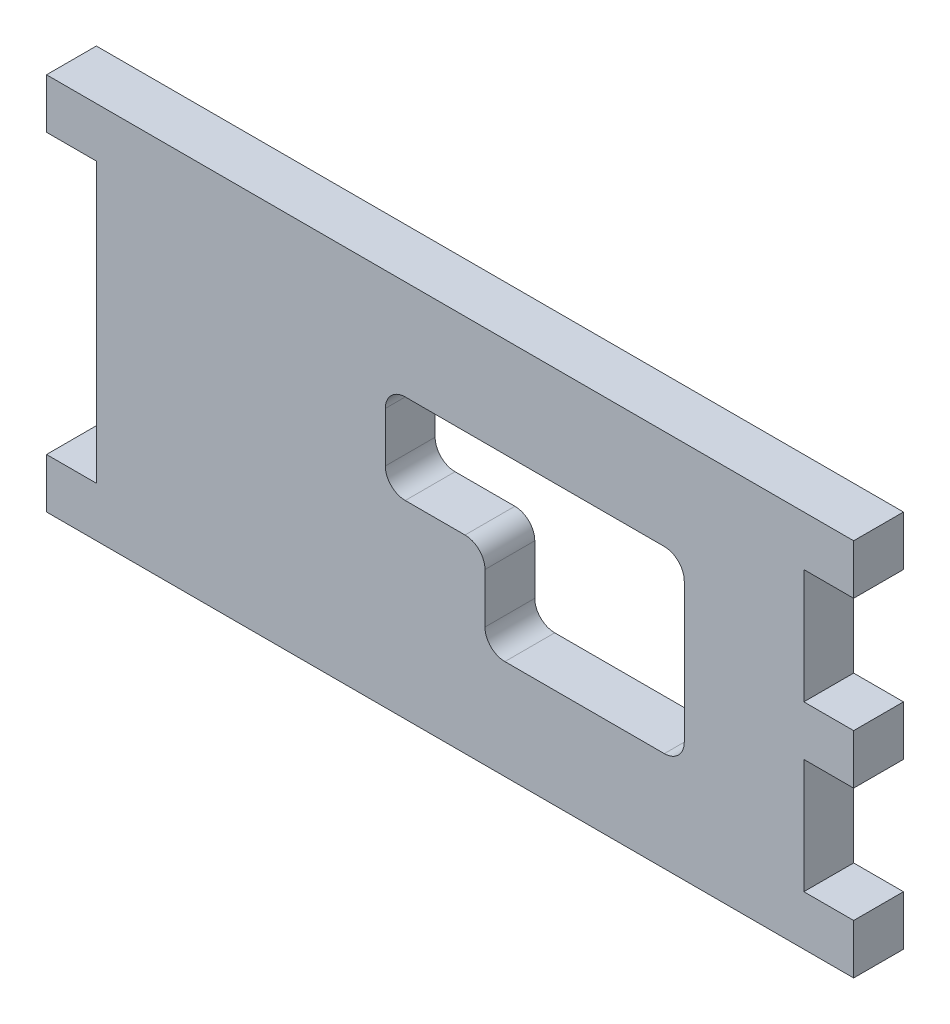
ISO-10303-21;
HEADER;
FILE_DESCRIPTION(('STEP AP214'),'2;1');
FILE_NAME('part.step','',(''),(''),'','','');
FILE_SCHEMA(('AUTOMOTIVE_DESIGN { 1 0 10303 214 1 1 1 1 }'));
ENDSEC;
DATA;
#1=APPLICATION_CONTEXT('core data for automotive mechanical design processes');
#2=APPLICATION_PROTOCOL_DEFINITION('international standard','automotive_design',2000,#1);
#3=PRODUCT_CONTEXT('',#1,'mechanical');
#4=PRODUCT('Part','Part','',(#3));
#5=PRODUCT_RELATED_PRODUCT_CATEGORY('part','',(#4));
#6=PRODUCT_DEFINITION_FORMATION('','',#4);
#7=PRODUCT_DEFINITION_CONTEXT('part definition',#1,'design');
#8=PRODUCT_DEFINITION('design','',#6,#7);
#9=PRODUCT_DEFINITION_SHAPE('','',#8);
#10=(LENGTH_UNIT() NAMED_UNIT(*) SI_UNIT(.MILLI.,.METRE.));
#11=(NAMED_UNIT(*) PLANE_ANGLE_UNIT() SI_UNIT($,.RADIAN.));
#12=(NAMED_UNIT(*) SI_UNIT($,.STERADIAN.) SOLID_ANGLE_UNIT());
#13=UNCERTAINTY_MEASURE_WITH_UNIT(LENGTH_MEASURE(1.E-05),#10,'distance_accuracy_value','');
#14=(GEOMETRIC_REPRESENTATION_CONTEXT(3) GLOBAL_UNCERTAINTY_ASSIGNED_CONTEXT((#13)) GLOBAL_UNIT_ASSIGNED_CONTEXT((#10,
#11,#12)) REPRESENTATION_CONTEXT('',''));
#15=CARTESIAN_POINT('',(0.,0.,0.));
#16=DIRECTION('',(0.,0.,1.));
#17=DIRECTION('',(1.,0.,0.));
#18=AXIS2_PLACEMENT_3D('',#15,#16,#17);
#19=CARTESIAN_POINT('',(0.,0.,5.));
#20=DIRECTION('',(0.,0.,-1.));
#21=DIRECTION('',(-1.,0.,0.));
#22=AXIS2_PLACEMENT_3D('',#19,#20,#21);
#23=PLANE('',#22);
#24=DIRECTION('',(-1.,0.,0.));
#25=VECTOR('',#24,1.);
#26=CARTESIAN_POINT('',(71.,38.,5.));
#27=LINE('',#26,#25);
#28=CARTESIAN_POINT('',(76.,38.,5.));
#29=VERTEX_POINT('',#28);
#30=CARTESIAN_POINT('',(-5.,38.,5.));
#31=VERTEX_POINT('',#30);
#32=EDGE_CURVE('E224',#29,#31,#27,.T.);
#33=ORIENTED_EDGE('',*,*,#32,.T.);
#34=DIRECTION('',(0.,-1.,0.));
#35=VECTOR('',#34,1.);
#36=CARTESIAN_POINT('',(-5.,38.,5.));
#37=LINE('',#36,#35);
#38=CARTESIAN_POINT('',(-5.,33.,5.));
#39=VERTEX_POINT('',#38);
#40=EDGE_CURVE('E227',#31,#39,#37,.T.);
#41=ORIENTED_EDGE('',*,*,#40,.T.);
#42=DIRECTION('',(1.,0.,0.));
#43=VECTOR('',#42,1.);
#44=CARTESIAN_POINT('',(0.,33.,5.));
#45=LINE('',#44,#43);
#46=CARTESIAN_POINT('',(0.,33.,5.));
#47=VERTEX_POINT('',#46);
#48=EDGE_CURVE('E251',#39,#47,#45,.T.);
#49=ORIENTED_EDGE('',*,*,#48,.T.);
#50=DIRECTION('',(0.,-1.,0.));
#51=VECTOR('',#50,1.);
#52=CARTESIAN_POINT('',(0.,5.,5.));
#53=LINE('',#52,#51);
#54=CARTESIAN_POINT('',(0.,5.,5.));
#55=VERTEX_POINT('',#54);
#56=EDGE_CURVE('E254',#47,#55,#53,.T.);
#57=ORIENTED_EDGE('',*,*,#56,.T.);
#58=DIRECTION('',(-1.,0.,0.));
#59=VECTOR('',#58,1.);
#60=CARTESIAN_POINT('',(0.,5.,5.));
#61=LINE('',#60,#59);
#62=CARTESIAN_POINT('',(-5.,5.,5.));
#63=VERTEX_POINT('',#62);
#64=EDGE_CURVE('E260',#55,#63,#61,.T.);
#65=ORIENTED_EDGE('',*,*,#64,.T.);
#66=DIRECTION('',(0.,-1.,0.));
#67=VECTOR('',#66,1.);
#68=CARTESIAN_POINT('',(-5.,5.,5.));
#69=LINE('',#68,#67);
#70=CARTESIAN_POINT('',(-5.,0.,5.));
#71=VERTEX_POINT('',#70);
#72=EDGE_CURVE('E263',#63,#71,#69,.T.);
#73=ORIENTED_EDGE('',*,*,#72,.T.);
#74=DIRECTION('',(1.,0.,0.));
#75=VECTOR('',#74,1.);
#76=CARTESIAN_POINT('',(0.,0.,5.));
#77=LINE('',#76,#75);
#78=CARTESIAN_POINT('',(76.,0.,5.));
#79=VERTEX_POINT('',#78);
#80=EDGE_CURVE('E266',#71,#79,#77,.T.);
#81=ORIENTED_EDGE('',*,*,#80,.T.);
#82=DIRECTION('',(0.,1.,0.));
#83=VECTOR('',#82,1.);
#84=CARTESIAN_POINT('',(76.,0.,5.));
#85=LINE('',#84,#83);
#86=CARTESIAN_POINT('',(76.,5.,5.));
#87=VERTEX_POINT('',#86);
#88=EDGE_CURVE('E269',#79,#87,#85,.T.);
#89=ORIENTED_EDGE('',*,*,#88,.T.);
#90=DIRECTION('',(-1.,0.,0.));
#91=VECTOR('',#90,1.);
#92=CARTESIAN_POINT('',(71.,5.,5.));
#93=LINE('',#92,#91);
#94=CARTESIAN_POINT('',(71.,5.,5.));
#95=VERTEX_POINT('',#94);
#96=EDGE_CURVE('E272',#87,#95,#93,.T.);
#97=ORIENTED_EDGE('',*,*,#96,.T.);
#98=DIRECTION('',(0.,1.,0.));
#99=VECTOR('',#98,1.);
#100=CARTESIAN_POINT('',(71.,5.,5.));
#101=LINE('',#100,#99);
#102=CARTESIAN_POINT('',(71.,16.5,5.));
#103=VERTEX_POINT('',#102);
#104=EDGE_CURVE('E275',#95,#103,#101,.T.);
#105=ORIENTED_EDGE('',*,*,#104,.T.);
#106=DIRECTION('',(1.,0.,0.));
#107=VECTOR('',#106,1.);
#108=CARTESIAN_POINT('',(71.,16.5,5.));
#109=LINE('',#108,#107);
#110=CARTESIAN_POINT('',(76.,16.5,5.));
#111=VERTEX_POINT('',#110);
#112=EDGE_CURVE('E278',#103,#111,#109,.T.);
#113=ORIENTED_EDGE('',*,*,#112,.T.);
#114=DIRECTION('',(0.,1.,0.));
#115=VECTOR('',#114,1.);
#116=CARTESIAN_POINT('',(76.,21.5,5.));
#117=LINE('',#116,#115);
#118=CARTESIAN_POINT('',(76.,21.5,5.));
#119=VERTEX_POINT('',#118);
#120=EDGE_CURVE('E281',#111,#119,#117,.T.);
#121=ORIENTED_EDGE('',*,*,#120,.T.);
#122=DIRECTION('',(-1.,0.,0.));
#123=VECTOR('',#122,1.);
#124=CARTESIAN_POINT('',(71.,21.5,5.));
#125=LINE('',#124,#123);
#126=CARTESIAN_POINT('',(71.,21.5,5.));
#127=VERTEX_POINT('',#126);
#128=EDGE_CURVE('E284',#119,#127,#125,.T.);
#129=ORIENTED_EDGE('',*,*,#128,.T.);
#130=DIRECTION('',(0.,1.,0.));
#131=VECTOR('',#130,1.);
#132=CARTESIAN_POINT('',(71.,21.5,5.));
#133=LINE('',#132,#131);
#134=CARTESIAN_POINT('',(71.,33.,5.));
#135=VERTEX_POINT('',#134);
#136=EDGE_CURVE('E287',#127,#135,#133,.T.);
#137=ORIENTED_EDGE('',*,*,#136,.T.);
#138=DIRECTION('',(1.,0.,0.));
#139=VECTOR('',#138,1.);
#140=CARTESIAN_POINT('',(71.,33.,5.));
#141=LINE('',#140,#139);
#142=CARTESIAN_POINT('',(76.,33.,5.));
#143=VERTEX_POINT('',#142);
#144=EDGE_CURVE('E290',#135,#143,#141,.T.);
#145=ORIENTED_EDGE('',*,*,#144,.T.);
#146=DIRECTION('',(0.,1.,0.));
#147=VECTOR('',#146,1.);
#148=CARTESIAN_POINT('',(76.,38.,5.));
#149=LINE('',#148,#147);
#150=EDGE_CURVE('E230',#143,#29,#149,.T.);
#151=ORIENTED_EDGE('',*,*,#150,.T.);
#152=EDGE_LOOP('',(#33,#41,#49,#57,#65,#73,#81,#89,#97,#105,#113,#121,#129,#137,#145,#151));
#153=FACE_BOUND('',#152,.T.);
#154=DIRECTION('',(0.,-1.,0.));
#155=VECTOR('',#154,1.);
#156=CARTESIAN_POINT('',(39.,19.,5.));
#157=LINE('',#156,#155);
#158=CARTESIAN_POINT('',(39.,17.,5.));
#159=VERTEX_POINT('',#158);
#160=CARTESIAN_POINT('',(39.,12.,5.));
#161=VERTEX_POINT('',#160);
#162=EDGE_CURVE('E497',#159,#161,#157,.T.);
#163=ORIENTED_EDGE('',*,*,#162,.F.);
#164=CARTESIAN_POINT('',(37.,17.,5.));
#165=DIRECTION('',(0.,0.,-1.));
#166=DIRECTION('',(-1.,0.,0.));
#167=AXIS2_PLACEMENT_3D('',#164,#165,#166);
#168=CIRCLE('',#167,2.);
#169=CARTESIAN_POINT('',(37.,19.,5.));
#170=VERTEX_POINT('',#169);
#171=EDGE_CURVE('E438',#159,#170,#168,.F.);
#172=ORIENTED_EDGE('',*,*,#171,.T.);
#173=DIRECTION('',(1.,0.,0.));
#174=VECTOR('',#173,1.);
#175=CARTESIAN_POINT('',(39.,19.,5.));
#176=LINE('',#175,#174);
#177=CARTESIAN_POINT('',(31.,19.,5.));
#178=VERTEX_POINT('',#177);
#179=EDGE_CURVE('E492',#178,#170,#176,.T.);
#180=ORIENTED_EDGE('',*,*,#179,.F.);
#181=CARTESIAN_POINT('',(31.,21.,5.));
#182=DIRECTION('',(0.,0.,-1.));
#183=DIRECTION('',(-1.,0.,0.));
#184=AXIS2_PLACEMENT_3D('',#181,#182,#183);
#185=CIRCLE('',#184,2.);
#186=CARTESIAN_POINT('',(29.,21.,5.));
#187=VERTEX_POINT('',#186);
#188=EDGE_CURVE('E11',#178,#187,#185,.T.);
#189=ORIENTED_EDGE('',*,*,#188,.T.);
#190=DIRECTION('',(0.,-1.,0.));
#191=VECTOR('',#190,1.);
#192=CARTESIAN_POINT('',(29.,28.,5.));
#193=LINE('',#192,#191);
#194=CARTESIAN_POINT('',(29.,26.,5.));
#195=VERTEX_POINT('',#194);
#196=EDGE_CURVE('E489',#195,#187,#193,.T.);
#197=ORIENTED_EDGE('',*,*,#196,.F.);
#198=CARTESIAN_POINT('',(31.,26.,5.));
#199=DIRECTION('',(0.,0.,-1.));
#200=DIRECTION('',(-1.,0.,0.));
#201=AXIS2_PLACEMENT_3D('',#198,#199,#200);
#202=CIRCLE('',#201,2.);
#203=CARTESIAN_POINT('',(31.,28.,5.));
#204=VERTEX_POINT('',#203);
#205=EDGE_CURVE('E468',#195,#204,#202,.T.);
#206=ORIENTED_EDGE('',*,*,#205,.T.);
#207=DIRECTION('',(-1.,0.,0.));
#208=VECTOR('',#207,1.);
#209=CARTESIAN_POINT('',(39.,28.,5.));
#210=LINE('',#209,#208);
#211=CARTESIAN_POINT('',(57.,28.,5.));
#212=VERTEX_POINT('',#211);
#213=EDGE_CURVE('E493',#212,#204,#210,.T.);
#214=ORIENTED_EDGE('',*,*,#213,.F.);
#215=CARTESIAN_POINT('',(57.,26.,5.));
#216=DIRECTION('',(0.,0.,-1.));
#217=DIRECTION('',(-1.,0.,0.));
#218=AXIS2_PLACEMENT_3D('',#215,#216,#217);
#219=CIRCLE('',#218,2.);
#220=CARTESIAN_POINT('',(59.,26.,5.));
#221=VERTEX_POINT('',#220);
#222=EDGE_CURVE('E450',#212,#221,#219,.T.);
#223=ORIENTED_EDGE('',*,*,#222,.T.);
#224=DIRECTION('',(0.,1.,0.));
#225=VECTOR('',#224,1.);
#226=CARTESIAN_POINT('',(59.,28.,5.));
#227=LINE('',#226,#225);
#228=CARTESIAN_POINT('',(59.,12.,5.));
#229=VERTEX_POINT('',#228);
#230=EDGE_CURVE('E299',#229,#221,#227,.T.);
#231=ORIENTED_EDGE('',*,*,#230,.F.);
#232=CARTESIAN_POINT('',(57.,12.,5.));
#233=DIRECTION('',(0.,0.,-1.));
#234=DIRECTION('',(-1.,0.,0.));
#235=AXIS2_PLACEMENT_3D('',#232,#233,#234);
#236=CIRCLE('',#235,2.);
#237=CARTESIAN_POINT('',(57.,10.,5.));
#238=VERTEX_POINT('',#237);
#239=EDGE_CURVE('E456',#229,#238,#236,.T.);
#240=ORIENTED_EDGE('',*,*,#239,.T.);
#241=DIRECTION('',(1.,0.,0.));
#242=VECTOR('',#241,1.);
#243=CARTESIAN_POINT('',(39.,10.,5.));
#244=LINE('',#243,#242);
#245=CARTESIAN_POINT('',(41.,10.,5.));
#246=VERTEX_POINT('',#245);
#247=EDGE_CURVE('E506',#246,#238,#244,.T.);
#248=ORIENTED_EDGE('',*,*,#247,.F.);
#249=CARTESIAN_POINT('',(41.,12.,5.));
#250=DIRECTION('',(0.,0.,-1.));
#251=DIRECTION('',(-1.,0.,0.));
#252=AXIS2_PLACEMENT_3D('',#249,#250,#251);
#253=CIRCLE('',#252,2.);
#254=EDGE_CURVE('E462',#246,#161,#253,.T.);
#255=ORIENTED_EDGE('',*,*,#254,.T.);
#256=EDGE_LOOP('',(#163,#172,#180,#189,#197,#206,#214,#223,#231,#240,#248,#255));
#257=FACE_BOUND('',#256,.T.);
#258=ADVANCED_FACE('F39',(#153,#257),#23,.F.);
#259=CARTESIAN_POINT('',(0.,0.,0.));
#260=DIRECTION('',(0.,0.,-1.));
#261=DIRECTION('',(-1.,0.,0.));
#262=AXIS2_PLACEMENT_3D('',#259,#260,#261);
#263=PLANE('',#262);
#264=DIRECTION('',(-1.,0.,0.));
#265=VECTOR('',#264,1.);
#266=CARTESIAN_POINT('',(0.,38.,0.));
#267=LINE('',#266,#265);
#268=CARTESIAN_POINT('',(76.,38.,0.));
#269=VERTEX_POINT('',#268);
#270=CARTESIAN_POINT('',(-5.,38.,0.));
#271=VERTEX_POINT('',#270);
#272=EDGE_CURVE('E240',#269,#271,#267,.T.);
#273=ORIENTED_EDGE('',*,*,#272,.F.);
#274=DIRECTION('',(0.,1.,0.));
#275=VECTOR('',#274,1.);
#276=CARTESIAN_POINT('',(76.,38.,0.));
#277=LINE('',#276,#275);
#278=CARTESIAN_POINT('',(76.,33.,0.));
#279=VERTEX_POINT('',#278);
#280=EDGE_CURVE('E235',#279,#269,#277,.T.);
#281=ORIENTED_EDGE('',*,*,#280,.F.);
#282=DIRECTION('',(1.,0.,0.));
#283=VECTOR('',#282,1.);
#284=CARTESIAN_POINT('',(71.,33.,0.));
#285=LINE('',#284,#283);
#286=CARTESIAN_POINT('',(71.,33.,0.));
#287=VERTEX_POINT('',#286);
#288=EDGE_CURVE('E339',#287,#279,#285,.T.);
#289=ORIENTED_EDGE('',*,*,#288,.F.);
#290=DIRECTION('',(0.,1.,0.));
#291=VECTOR('',#290,1.);
#292=CARTESIAN_POINT('',(71.,21.5,0.));
#293=LINE('',#292,#291);
#294=CARTESIAN_POINT('',(71.,21.5,0.));
#295=VERTEX_POINT('',#294);
#296=EDGE_CURVE('E336',#295,#287,#293,.T.);
#297=ORIENTED_EDGE('',*,*,#296,.F.);
#298=DIRECTION('',(-1.,0.,0.));
#299=VECTOR('',#298,1.);
#300=CARTESIAN_POINT('',(71.,21.5,0.));
#301=LINE('',#300,#299);
#302=CARTESIAN_POINT('',(76.,21.5,0.));
#303=VERTEX_POINT('',#302);
#304=EDGE_CURVE('E333',#303,#295,#301,.T.);
#305=ORIENTED_EDGE('',*,*,#304,.F.);
#306=DIRECTION('',(0.,1.,0.));
#307=VECTOR('',#306,1.);
#308=CARTESIAN_POINT('',(76.,21.5,0.));
#309=LINE('',#308,#307);
#310=CARTESIAN_POINT('',(76.,16.5,0.));
#311=VERTEX_POINT('',#310);
#312=EDGE_CURVE('E330',#311,#303,#309,.T.);
#313=ORIENTED_EDGE('',*,*,#312,.F.);
#314=DIRECTION('',(1.,0.,0.));
#315=VECTOR('',#314,1.);
#316=CARTESIAN_POINT('',(71.,16.5,0.));
#317=LINE('',#316,#315);
#318=CARTESIAN_POINT('',(71.,16.5,0.));
#319=VERTEX_POINT('',#318);
#320=EDGE_CURVE('E327',#319,#311,#317,.T.);
#321=ORIENTED_EDGE('',*,*,#320,.F.);
#322=DIRECTION('',(0.,1.,0.));
#323=VECTOR('',#322,1.);
#324=CARTESIAN_POINT('',(71.,5.,0.));
#325=LINE('',#324,#323);
#326=CARTESIAN_POINT('',(71.,5.,0.));
#327=VERTEX_POINT('',#326);
#328=EDGE_CURVE('E324',#327,#319,#325,.T.);
#329=ORIENTED_EDGE('',*,*,#328,.F.);
#330=DIRECTION('',(-1.,0.,0.));
#331=VECTOR('',#330,1.);
#332=CARTESIAN_POINT('',(71.,5.,0.));
#333=LINE('',#332,#331);
#334=CARTESIAN_POINT('',(76.,5.,0.));
#335=VERTEX_POINT('',#334);
#336=EDGE_CURVE('E321',#335,#327,#333,.T.);
#337=ORIENTED_EDGE('',*,*,#336,.F.);
#338=DIRECTION('',(0.,1.,0.));
#339=VECTOR('',#338,1.);
#340=CARTESIAN_POINT('',(76.,0.,0.));
#341=LINE('',#340,#339);
#342=CARTESIAN_POINT('',(76.,0.,0.));
#343=VERTEX_POINT('',#342);
#344=EDGE_CURVE('E318',#343,#335,#341,.T.);
#345=ORIENTED_EDGE('',*,*,#344,.F.);
#346=DIRECTION('',(1.,0.,0.));
#347=VECTOR('',#346,1.);
#348=CARTESIAN_POINT('',(71.,0.,0.));
#349=LINE('',#348,#347);
#350=CARTESIAN_POINT('',(-5.,0.,0.));
#351=VERTEX_POINT('',#350);
#352=EDGE_CURVE('E315',#351,#343,#349,.T.);
#353=ORIENTED_EDGE('',*,*,#352,.F.);
#354=DIRECTION('',(0.,-1.,0.));
#355=VECTOR('',#354,1.);
#356=CARTESIAN_POINT('',(-5.,5.,0.));
#357=LINE('',#356,#355);
#358=CARTESIAN_POINT('',(-5.,5.,0.));
#359=VERTEX_POINT('',#358);
#360=EDGE_CURVE('E311',#359,#351,#357,.T.);
#361=ORIENTED_EDGE('',*,*,#360,.F.);
#362=DIRECTION('',(-1.,0.,0.));
#363=VECTOR('',#362,1.);
#364=CARTESIAN_POINT('',(0.,5.,0.));
#365=LINE('',#364,#363);
#366=CARTESIAN_POINT('',(0.,5.,0.));
#367=VERTEX_POINT('',#366);
#368=EDGE_CURVE('E308',#367,#359,#365,.T.);
#369=ORIENTED_EDGE('',*,*,#368,.F.);
#370=DIRECTION('',(0.,-1.,0.));
#371=VECTOR('',#370,1.);
#372=CARTESIAN_POINT('',(0.,5.,0.));
#373=LINE('',#372,#371);
#374=CARTESIAN_POINT('',(0.,33.,0.));
#375=VERTEX_POINT('',#374);
#376=EDGE_CURVE('E305',#375,#367,#373,.T.);
#377=ORIENTED_EDGE('',*,*,#376,.F.);
#378=DIRECTION('',(1.,0.,0.));
#379=VECTOR('',#378,1.);
#380=CARTESIAN_POINT('',(0.,33.,0.));
#381=LINE('',#380,#379);
#382=CARTESIAN_POINT('',(-5.,33.,0.));
#383=VERTEX_POINT('',#382);
#384=EDGE_CURVE('E302',#383,#375,#381,.T.);
#385=ORIENTED_EDGE('',*,*,#384,.F.);
#386=DIRECTION('',(0.,-1.,0.));
#387=VECTOR('',#386,1.);
#388=CARTESIAN_POINT('',(-5.,38.,0.));
#389=LINE('',#388,#387);
#390=EDGE_CURVE('E298',#271,#383,#389,.T.);
#391=ORIENTED_EDGE('',*,*,#390,.F.);
#392=EDGE_LOOP('',(#273,#281,#289,#297,#305,#313,#321,#329,#337,#345,#353,#361,#369,#377,#385,#391));
#393=FACE_BOUND('',#392,.T.);
#394=DIRECTION('',(1.,0.,0.));
#395=VECTOR('',#394,1.);
#396=CARTESIAN_POINT('',(39.,19.,0.));
#397=LINE('',#396,#395);
#398=CARTESIAN_POINT('',(31.,19.,0.));
#399=VERTEX_POINT('',#398);
#400=CARTESIAN_POINT('',(37.,19.,0.));
#401=VERTEX_POINT('',#400);
#402=EDGE_CURVE('E476',#399,#401,#397,.T.);
#403=ORIENTED_EDGE('',*,*,#402,.T.);
#404=CARTESIAN_POINT('',(37.,17.,0.));
#405=DIRECTION('',(0.,0.,-1.));
#406=DIRECTION('',(-1.,0.,0.));
#407=AXIS2_PLACEMENT_3D('',#404,#405,#406);
#408=CIRCLE('',#407,2.);
#409=CARTESIAN_POINT('',(39.,17.,0.));
#410=VERTEX_POINT('',#409);
#411=EDGE_CURVE('E435',#401,#410,#408,.T.);
#412=ORIENTED_EDGE('',*,*,#411,.T.);
#413=DIRECTION('',(0.,-1.,0.));
#414=VECTOR('',#413,1.);
#415=CARTESIAN_POINT('',(39.,19.,0.));
#416=LINE('',#415,#414);
#417=CARTESIAN_POINT('',(39.,12.,0.));
#418=VERTEX_POINT('',#417);
#419=EDGE_CURVE('E486',#410,#418,#416,.T.);
#420=ORIENTED_EDGE('',*,*,#419,.T.);
#421=CARTESIAN_POINT('',(41.,12.,0.));
#422=DIRECTION('',(0.,0.,-1.));
#423=DIRECTION('',(-1.,0.,0.));
#424=AXIS2_PLACEMENT_3D('',#421,#422,#423);
#425=CIRCLE('',#424,2.);
#426=CARTESIAN_POINT('',(41.,10.,0.));
#427=VERTEX_POINT('',#426);
#428=EDGE_CURVE('E459',#418,#427,#425,.F.);
#429=ORIENTED_EDGE('',*,*,#428,.T.);
#430=DIRECTION('',(1.,0.,0.));
#431=VECTOR('',#430,1.);
#432=CARTESIAN_POINT('',(39.,10.,0.));
#433=LINE('',#432,#431);
#434=CARTESIAN_POINT('',(57.,10.,0.));
#435=VERTEX_POINT('',#434);
#436=EDGE_CURVE('E518',#427,#435,#433,.T.);
#437=ORIENTED_EDGE('',*,*,#436,.T.);
#438=CARTESIAN_POINT('',(57.,12.,0.));
#439=DIRECTION('',(0.,0.,-1.));
#440=DIRECTION('',(-1.,0.,0.));
#441=AXIS2_PLACEMENT_3D('',#438,#439,#440);
#442=CIRCLE('',#441,2.);
#443=CARTESIAN_POINT('',(59.,12.,0.));
#444=VERTEX_POINT('',#443);
#445=EDGE_CURVE('E453',#435,#444,#442,.F.);
#446=ORIENTED_EDGE('',*,*,#445,.T.);
#447=DIRECTION('',(0.,1.,0.));
#448=VECTOR('',#447,1.);
#449=CARTESIAN_POINT('',(59.,28.,0.));
#450=LINE('',#449,#448);
#451=CARTESIAN_POINT('',(59.,26.,0.));
#452=VERTEX_POINT('',#451);
#453=EDGE_CURVE('E522',#444,#452,#450,.T.);
#454=ORIENTED_EDGE('',*,*,#453,.T.);
#455=CARTESIAN_POINT('',(57.,26.,0.));
#456=DIRECTION('',(0.,0.,-1.));
#457=DIRECTION('',(-1.,0.,0.));
#458=AXIS2_PLACEMENT_3D('',#455,#456,#457);
#459=CIRCLE('',#458,2.);
#460=CARTESIAN_POINT('',(57.,28.,0.));
#461=VERTEX_POINT('',#460);
#462=EDGE_CURVE('E447',#452,#461,#459,.F.);
#463=ORIENTED_EDGE('',*,*,#462,.T.);
#464=DIRECTION('',(-1.,0.,0.));
#465=VECTOR('',#464,1.);
#466=CARTESIAN_POINT('',(39.,28.,0.));
#467=LINE('',#466,#465);
#468=CARTESIAN_POINT('',(31.,28.,0.));
#469=VERTEX_POINT('',#468);
#470=EDGE_CURVE('E500',#461,#469,#467,.T.);
#471=ORIENTED_EDGE('',*,*,#470,.T.);
#472=CARTESIAN_POINT('',(31.,26.,0.));
#473=DIRECTION('',(0.,0.,-1.));
#474=DIRECTION('',(-1.,0.,0.));
#475=AXIS2_PLACEMENT_3D('',#472,#473,#474);
#476=CIRCLE('',#475,2.);
#477=CARTESIAN_POINT('',(29.,26.,0.));
#478=VERTEX_POINT('',#477);
#479=EDGE_CURVE('E465',#469,#478,#476,.F.);
#480=ORIENTED_EDGE('',*,*,#479,.T.);
#481=DIRECTION('',(0.,-1.,0.));
#482=VECTOR('',#481,1.);
#483=CARTESIAN_POINT('',(29.,28.,0.));
#484=LINE('',#483,#482);
#485=CARTESIAN_POINT('',(29.,21.,0.));
#486=VERTEX_POINT('',#485);
#487=EDGE_CURVE('E477',#478,#486,#484,.T.);
#488=ORIENTED_EDGE('',*,*,#487,.T.);
#489=CARTESIAN_POINT('',(31.,21.,0.));
#490=DIRECTION('',(0.,0.,-1.));
#491=DIRECTION('',(-1.,0.,0.));
#492=AXIS2_PLACEMENT_3D('',#489,#490,#491);
#493=CIRCLE('',#492,2.);
#494=EDGE_CURVE('E48',#486,#399,#493,.F.);
#495=ORIENTED_EDGE('',*,*,#494,.T.);
#496=EDGE_LOOP('',(#403,#412,#420,#429,#437,#446,#454,#463,#471,#480,#488,#495));
#497=FACE_BOUND('',#496,.T.);
#498=ADVANCED_FACE('F475',(#393,#497),#263,.T.);
#499=CARTESIAN_POINT('',(0.,38.,5.));
#500=DIRECTION('',(0.,-1.,0.));
#501=DIRECTION('',(0.,0.,-1.));
#502=AXIS2_PLACEMENT_3D('',#499,#500,#501);
#503=PLANE('',#502);
#504=ORIENTED_EDGE('',*,*,#272,.T.);
#505=DIRECTION('',(0.,0.,-1.));
#506=VECTOR('',#505,1.);
#507=CARTESIAN_POINT('',(-5.,38.,5.));
#508=LINE('',#507,#506);
#509=EDGE_CURVE('E238',#31,#271,#508,.T.);
#510=ORIENTED_EDGE('',*,*,#509,.F.);
#511=ORIENTED_EDGE('',*,*,#32,.F.);
#512=DIRECTION('',(0.,0.,-1.));
#513=VECTOR('',#512,1.);
#514=CARTESIAN_POINT('',(76.,38.,5.));
#515=LINE('',#514,#513);
#516=EDGE_CURVE('E295',#29,#269,#515,.T.);
#517=ORIENTED_EDGE('',*,*,#516,.T.);
#518=EDGE_LOOP('',(#504,#510,#511,#517));
#519=FACE_BOUND('',#518,.T.);
#520=ADVANCED_FACE('F239',(#519),#503,.F.);
#521=CARTESIAN_POINT('',(-5.,38.,5.));
#522=DIRECTION('',(1.,0.,0.));
#523=DIRECTION('',(0.,0.,-1.));
#524=AXIS2_PLACEMENT_3D('',#521,#522,#523);
#525=PLANE('',#524);
#526=ORIENTED_EDGE('',*,*,#390,.T.);
#527=DIRECTION('',(0.,0.,-1.));
#528=VECTOR('',#527,1.);
#529=CARTESIAN_POINT('',(-5.,33.,5.));
#530=LINE('',#529,#528);
#531=EDGE_CURVE('E245',#39,#383,#530,.T.);
#532=ORIENTED_EDGE('',*,*,#531,.F.);
#533=ORIENTED_EDGE('',*,*,#40,.F.);
#534=ORIENTED_EDGE('',*,*,#509,.T.);
#535=EDGE_LOOP('',(#526,#532,#533,#534));
#536=FACE_BOUND('',#535,.T.);
#537=ADVANCED_FACE('F247',(#536),#525,.F.);
#538=CARTESIAN_POINT('',(0.,33.,5.));
#539=DIRECTION('',(0.,1.,0.));
#540=DIRECTION('',(0.,0.,1.));
#541=AXIS2_PLACEMENT_3D('',#538,#539,#540);
#542=PLANE('',#541);
#543=ORIENTED_EDGE('',*,*,#384,.T.);
#544=DIRECTION('',(0.,0.,-1.));
#545=VECTOR('',#544,1.);
#546=CARTESIAN_POINT('',(0.,33.,5.));
#547=LINE('',#546,#545);
#548=EDGE_CURVE('E395',#47,#375,#547,.T.);
#549=ORIENTED_EDGE('',*,*,#548,.F.);
#550=ORIENTED_EDGE('',*,*,#48,.F.);
#551=ORIENTED_EDGE('',*,*,#531,.T.);
#552=EDGE_LOOP('',(#543,#549,#550,#551));
#553=FACE_BOUND('',#552,.T.);
#554=ADVANCED_FACE('F633',(#553),#542,.F.);
#555=CARTESIAN_POINT('',(0.,5.,5.));
#556=DIRECTION('',(1.,0.,0.));
#557=DIRECTION('',(0.,1.,0.));
#558=AXIS2_PLACEMENT_3D('',#555,#556,#557);
#559=PLANE('',#558);
#560=ORIENTED_EDGE('',*,*,#376,.T.);
#561=DIRECTION('',(0.,0.,-1.));
#562=VECTOR('',#561,1.);
#563=CARTESIAN_POINT('',(0.,5.,5.));
#564=LINE('',#563,#562);
#565=EDGE_CURVE('E391',#55,#367,#564,.T.);
#566=ORIENTED_EDGE('',*,*,#565,.F.);
#567=ORIENTED_EDGE('',*,*,#56,.F.);
#568=ORIENTED_EDGE('',*,*,#548,.T.);
#569=EDGE_LOOP('',(#560,#566,#567,#568));
#570=FACE_BOUND('',#569,.T.);
#571=ADVANCED_FACE('F629',(#570),#559,.F.);
#572=CARTESIAN_POINT('',(0.,5.,5.));
#573=DIRECTION('',(0.,-1.,0.));
#574=DIRECTION('',(0.,0.,-1.));
#575=AXIS2_PLACEMENT_3D('',#572,#573,#574);
#576=PLANE('',#575);
#577=ORIENTED_EDGE('',*,*,#368,.T.);
#578=DIRECTION('',(0.,0.,-1.));
#579=VECTOR('',#578,1.);
#580=CARTESIAN_POINT('',(-5.,5.,5.));
#581=LINE('',#580,#579);
#582=EDGE_CURVE('E387',#63,#359,#581,.T.);
#583=ORIENTED_EDGE('',*,*,#582,.F.);
#584=ORIENTED_EDGE('',*,*,#64,.F.);
#585=ORIENTED_EDGE('',*,*,#565,.T.);
#586=EDGE_LOOP('',(#577,#583,#584,#585));
#587=FACE_BOUND('',#586,.T.);
#588=ADVANCED_FACE('F625',(#587),#576,.F.);
#589=CARTESIAN_POINT('',(-5.,5.,5.));
#590=DIRECTION('',(1.,0.,0.));
#591=DIRECTION('',(0.,0.,-1.));
#592=AXIS2_PLACEMENT_3D('',#589,#590,#591);
#593=PLANE('',#592);
#594=ORIENTED_EDGE('',*,*,#360,.T.);
#595=DIRECTION('',(0.,0.,-1.));
#596=VECTOR('',#595,1.);
#597=CARTESIAN_POINT('',(-5.,0.,5.));
#598=LINE('',#597,#596);
#599=EDGE_CURVE('E383',#71,#351,#598,.T.);
#600=ORIENTED_EDGE('',*,*,#599,.F.);
#601=ORIENTED_EDGE('',*,*,#72,.F.);
#602=ORIENTED_EDGE('',*,*,#582,.T.);
#603=EDGE_LOOP('',(#594,#600,#601,#602));
#604=FACE_BOUND('',#603,.T.);
#605=ADVANCED_FACE('F621',(#604),#593,.F.);
#606=CARTESIAN_POINT('',(71.,0.,5.));
#607=DIRECTION('',(0.,1.,0.));
#608=DIRECTION('',(0.,0.,1.));
#609=AXIS2_PLACEMENT_3D('',#606,#607,#608);
#610=PLANE('',#609);
#611=ORIENTED_EDGE('',*,*,#352,.T.);
#612=DIRECTION('',(0.,0.,-1.));
#613=VECTOR('',#612,1.);
#614=CARTESIAN_POINT('',(76.,0.,5.));
#615=LINE('',#614,#613);
#616=EDGE_CURVE('E379',#79,#343,#615,.T.);
#617=ORIENTED_EDGE('',*,*,#616,.F.);
#618=ORIENTED_EDGE('',*,*,#80,.F.);
#619=ORIENTED_EDGE('',*,*,#599,.T.);
#620=EDGE_LOOP('',(#611,#617,#618,#619));
#621=FACE_BOUND('',#620,.T.);
#622=ADVANCED_FACE('F617',(#621),#610,.F.);
#623=CARTESIAN_POINT('',(76.,0.,5.));
#624=DIRECTION('',(-1.,0.,0.));
#625=DIRECTION('',(0.,0.,1.));
#626=AXIS2_PLACEMENT_3D('',#623,#624,#625);
#627=PLANE('',#626);
#628=ORIENTED_EDGE('',*,*,#344,.T.);
#629=DIRECTION('',(0.,0.,-1.));
#630=VECTOR('',#629,1.);
#631=CARTESIAN_POINT('',(76.,5.,5.));
#632=LINE('',#631,#630);
#633=EDGE_CURVE('E375',#87,#335,#632,.T.);
#634=ORIENTED_EDGE('',*,*,#633,.F.);
#635=ORIENTED_EDGE('',*,*,#88,.F.);
#636=ORIENTED_EDGE('',*,*,#616,.T.);
#637=EDGE_LOOP('',(#628,#634,#635,#636));
#638=FACE_BOUND('',#637,.T.);
#639=ADVANCED_FACE('F613',(#638),#627,.F.);
#640=CARTESIAN_POINT('',(71.,5.,5.));
#641=DIRECTION('',(0.,-1.,0.));
#642=DIRECTION('',(0.,0.,-1.));
#643=AXIS2_PLACEMENT_3D('',#640,#641,#642);
#644=PLANE('',#643);
#645=ORIENTED_EDGE('',*,*,#336,.T.);
#646=DIRECTION('',(0.,0.,-1.));
#647=VECTOR('',#646,1.);
#648=CARTESIAN_POINT('',(71.,5.,5.));
#649=LINE('',#648,#647);
#650=EDGE_CURVE('E371',#95,#327,#649,.T.);
#651=ORIENTED_EDGE('',*,*,#650,.F.);
#652=ORIENTED_EDGE('',*,*,#96,.F.);
#653=ORIENTED_EDGE('',*,*,#633,.T.);
#654=EDGE_LOOP('',(#645,#651,#652,#653));
#655=FACE_BOUND('',#654,.T.);
#656=ADVANCED_FACE('F609',(#655),#644,.F.);
#657=CARTESIAN_POINT('',(71.,5.,5.));
#658=DIRECTION('',(-1.,0.,0.));
#659=DIRECTION('',(0.,0.,1.));
#660=AXIS2_PLACEMENT_3D('',#657,#658,#659);
#661=PLANE('',#660);
#662=ORIENTED_EDGE('',*,*,#328,.T.);
#663=DIRECTION('',(0.,0.,-1.));
#664=VECTOR('',#663,1.);
#665=CARTESIAN_POINT('',(71.,16.5,5.));
#666=LINE('',#665,#664);
#667=EDGE_CURVE('E367',#103,#319,#666,.T.);
#668=ORIENTED_EDGE('',*,*,#667,.F.);
#669=ORIENTED_EDGE('',*,*,#104,.F.);
#670=ORIENTED_EDGE('',*,*,#650,.T.);
#671=EDGE_LOOP('',(#662,#668,#669,#670));
#672=FACE_BOUND('',#671,.T.);
#673=ADVANCED_FACE('F605',(#672),#661,.F.);
#674=CARTESIAN_POINT('',(71.,16.5,5.));
#675=DIRECTION('',(0.,1.,0.));
#676=DIRECTION('',(0.,0.,1.));
#677=AXIS2_PLACEMENT_3D('',#674,#675,#676);
#678=PLANE('',#677);
#679=ORIENTED_EDGE('',*,*,#320,.T.);
#680=DIRECTION('',(0.,0.,-1.));
#681=VECTOR('',#680,1.);
#682=CARTESIAN_POINT('',(76.,16.5,5.));
#683=LINE('',#682,#681);
#684=EDGE_CURVE('E363',#111,#311,#683,.T.);
#685=ORIENTED_EDGE('',*,*,#684,.F.);
#686=ORIENTED_EDGE('',*,*,#112,.F.);
#687=ORIENTED_EDGE('',*,*,#667,.T.);
#688=EDGE_LOOP('',(#679,#685,#686,#687));
#689=FACE_BOUND('',#688,.T.);
#690=ADVANCED_FACE('F601',(#689),#678,.F.);
#691=CARTESIAN_POINT('',(76.,21.5,5.));
#692=DIRECTION('',(-1.,0.,0.));
#693=DIRECTION('',(0.,0.,1.));
#694=AXIS2_PLACEMENT_3D('',#691,#692,#693);
#695=PLANE('',#694);
#696=ORIENTED_EDGE('',*,*,#312,.T.);
#697=DIRECTION('',(0.,0.,-1.));
#698=VECTOR('',#697,1.);
#699=CARTESIAN_POINT('',(76.,21.5,5.));
#700=LINE('',#699,#698);
#701=EDGE_CURVE('E359',#119,#303,#700,.T.);
#702=ORIENTED_EDGE('',*,*,#701,.F.);
#703=ORIENTED_EDGE('',*,*,#120,.F.);
#704=ORIENTED_EDGE('',*,*,#684,.T.);
#705=EDGE_LOOP('',(#696,#702,#703,#704));
#706=FACE_BOUND('',#705,.T.);
#707=ADVANCED_FACE('F597',(#706),#695,.F.);
#708=CARTESIAN_POINT('',(71.,21.5,5.));
#709=DIRECTION('',(0.,-1.,0.));
#710=DIRECTION('',(0.,0.,-1.));
#711=AXIS2_PLACEMENT_3D('',#708,#709,#710);
#712=PLANE('',#711);
#713=ORIENTED_EDGE('',*,*,#304,.T.);
#714=DIRECTION('',(0.,0.,-1.));
#715=VECTOR('',#714,1.);
#716=CARTESIAN_POINT('',(71.,21.5,5.));
#717=LINE('',#716,#715);
#718=EDGE_CURVE('E355',#127,#295,#717,.T.);
#719=ORIENTED_EDGE('',*,*,#718,.F.);
#720=ORIENTED_EDGE('',*,*,#128,.F.);
#721=ORIENTED_EDGE('',*,*,#701,.T.);
#722=EDGE_LOOP('',(#713,#719,#720,#721));
#723=FACE_BOUND('',#722,.T.);
#724=ADVANCED_FACE('F593',(#723),#712,.F.);
#725=CARTESIAN_POINT('',(71.,21.5,5.));
#726=DIRECTION('',(-1.,0.,0.));
#727=DIRECTION('',(0.,0.,1.));
#728=AXIS2_PLACEMENT_3D('',#725,#726,#727);
#729=PLANE('',#728);
#730=ORIENTED_EDGE('',*,*,#296,.T.);
#731=DIRECTION('',(0.,0.,-1.));
#732=VECTOR('',#731,1.);
#733=CARTESIAN_POINT('',(71.,33.,5.));
#734=LINE('',#733,#732);
#735=EDGE_CURVE('E351',#135,#287,#734,.T.);
#736=ORIENTED_EDGE('',*,*,#735,.F.);
#737=ORIENTED_EDGE('',*,*,#136,.F.);
#738=ORIENTED_EDGE('',*,*,#718,.T.);
#739=EDGE_LOOP('',(#730,#736,#737,#738));
#740=FACE_BOUND('',#739,.T.);
#741=ADVANCED_FACE('F589',(#740),#729,.F.);
#742=CARTESIAN_POINT('',(71.,33.,5.));
#743=DIRECTION('',(0.,1.,0.));
#744=DIRECTION('',(0.,0.,1.));
#745=AXIS2_PLACEMENT_3D('',#742,#743,#744);
#746=PLANE('',#745);
#747=ORIENTED_EDGE('',*,*,#288,.T.);
#748=DIRECTION('',(0.,0.,-1.));
#749=VECTOR('',#748,1.);
#750=CARTESIAN_POINT('',(76.,33.,5.));
#751=LINE('',#750,#749);
#752=EDGE_CURVE('E347',#143,#279,#751,.T.);
#753=ORIENTED_EDGE('',*,*,#752,.F.);
#754=ORIENTED_EDGE('',*,*,#144,.F.);
#755=ORIENTED_EDGE('',*,*,#735,.T.);
#756=EDGE_LOOP('',(#747,#753,#754,#755));
#757=FACE_BOUND('',#756,.T.);
#758=ADVANCED_FACE('F585',(#757),#746,.F.);
#759=CARTESIAN_POINT('',(76.,38.,5.));
#760=DIRECTION('',(-1.,0.,0.));
#761=DIRECTION('',(0.,0.,1.));
#762=AXIS2_PLACEMENT_3D('',#759,#760,#761);
#763=PLANE('',#762);
#764=ORIENTED_EDGE('',*,*,#280,.T.);
#765=ORIENTED_EDGE('',*,*,#516,.F.);
#766=ORIENTED_EDGE('',*,*,#150,.F.);
#767=ORIENTED_EDGE('',*,*,#752,.T.);
#768=EDGE_LOOP('',(#764,#765,#766,#767));
#769=FACE_BOUND('',#768,.T.);
#770=ADVANCED_FACE('F582',(#769),#763,.F.);
#771=CARTESIAN_POINT('',(29.,28.,5.));
#772=DIRECTION('',(1.,0.,0.));
#773=DIRECTION('',(0.,0.,-1.));
#774=AXIS2_PLACEMENT_3D('',#771,#772,#773);
#775=PLANE('',#774);
#776=ORIENTED_EDGE('',*,*,#487,.F.);
#777=DIRECTION('',(0.,0.,-1.));
#778=VECTOR('',#777,1.);
#779=CARTESIAN_POINT('',(29.,26.,5.));
#780=LINE('',#779,#778);
#781=EDGE_CURVE('E60',#478,#195,#780,.F.);
#782=ORIENTED_EDGE('',*,*,#781,.T.);
#783=ORIENTED_EDGE('',*,*,#196,.T.);
#784=DIRECTION('',(0.,0.,-1.));
#785=VECTOR('',#784,1.);
#786=CARTESIAN_POINT('',(29.,21.,0.));
#787=LINE('',#786,#785);
#788=EDGE_CURVE('E441',#187,#486,#787,.T.);
#789=ORIENTED_EDGE('',*,*,#788,.T.);
#790=EDGE_LOOP('',(#776,#782,#783,#789));
#791=FACE_BOUND('',#790,.T.);
#792=ADVANCED_FACE('F488',(#791),#775,.T.);
#793=CARTESIAN_POINT('',(39.,19.,5.));
#794=DIRECTION('',(0.,1.,0.));
#795=DIRECTION('',(0.,0.,1.));
#796=AXIS2_PLACEMENT_3D('',#793,#794,#795);
#797=PLANE('',#796);
#798=ORIENTED_EDGE('',*,*,#179,.T.);
#799=DIRECTION('',(0.,0.,-1.));
#800=VECTOR('',#799,1.);
#801=CARTESIAN_POINT('',(37.,19.,5.));
#802=LINE('',#801,#800);
#803=EDGE_CURVE('E431',#170,#401,#802,.T.);
#804=ORIENTED_EDGE('',*,*,#803,.T.);
#805=ORIENTED_EDGE('',*,*,#402,.F.);
#806=DIRECTION('',(0.,0.,-1.));
#807=VECTOR('',#806,1.);
#808=CARTESIAN_POINT('',(31.,19.,5.));
#809=LINE('',#808,#807);
#810=EDGE_CURVE('E428',#399,#178,#809,.F.);
#811=ORIENTED_EDGE('',*,*,#810,.T.);
#812=EDGE_LOOP('',(#798,#804,#805,#811));
#813=FACE_BOUND('',#812,.T.);
#814=ADVANCED_FACE('F483',(#813),#797,.T.);
#815=CARTESIAN_POINT('',(39.,19.,5.));
#816=DIRECTION('',(1.,0.,0.));
#817=DIRECTION('',(0.,0.,-1.));
#818=AXIS2_PLACEMENT_3D('',#815,#816,#817);
#819=PLANE('',#818);
#820=ORIENTED_EDGE('',*,*,#162,.T.);
#821=DIRECTION('',(0.,0.,-1.));
#822=VECTOR('',#821,1.);
#823=CARTESIAN_POINT('',(39.,12.,0.));
#824=LINE('',#823,#822);
#825=EDGE_CURVE('E424',#161,#418,#824,.T.);
#826=ORIENTED_EDGE('',*,*,#825,.T.);
#827=ORIENTED_EDGE('',*,*,#419,.F.);
#828=DIRECTION('',(0.,0.,-1.));
#829=VECTOR('',#828,1.);
#830=CARTESIAN_POINT('',(39.,17.,5.));
#831=LINE('',#830,#829);
#832=EDGE_CURVE('E421',#410,#159,#831,.F.);
#833=ORIENTED_EDGE('',*,*,#832,.T.);
#834=EDGE_LOOP('',(#820,#826,#827,#833));
#835=FACE_BOUND('',#834,.T.);
#836=ADVANCED_FACE('F558',(#835),#819,.T.);
#837=CARTESIAN_POINT('',(39.,10.,5.));
#838=DIRECTION('',(0.,1.,0.));
#839=DIRECTION('',(0.,0.,1.));
#840=AXIS2_PLACEMENT_3D('',#837,#838,#839);
#841=PLANE('',#840);
#842=ORIENTED_EDGE('',*,*,#247,.T.);
#843=DIRECTION('',(0.,0.,-1.));
#844=VECTOR('',#843,1.);
#845=CARTESIAN_POINT('',(57.,10.,0.));
#846=LINE('',#845,#844);
#847=EDGE_CURVE('E417',#238,#435,#846,.T.);
#848=ORIENTED_EDGE('',*,*,#847,.T.);
#849=ORIENTED_EDGE('',*,*,#436,.F.);
#850=DIRECTION('',(0.,0.,-1.));
#851=VECTOR('',#850,1.);
#852=CARTESIAN_POINT('',(41.,10.,5.));
#853=LINE('',#852,#851);
#854=EDGE_CURVE('E414',#427,#246,#853,.F.);
#855=ORIENTED_EDGE('',*,*,#854,.T.);
#856=EDGE_LOOP('',(#842,#848,#849,#855));
#857=FACE_BOUND('',#856,.T.);
#858=ADVANCED_FACE('F550',(#857),#841,.T.);
#859=CARTESIAN_POINT('',(59.,28.,5.));
#860=DIRECTION('',(-1.,0.,0.));
#861=DIRECTION('',(0.,0.,1.));
#862=AXIS2_PLACEMENT_3D('',#859,#860,#861);
#863=PLANE('',#862);
#864=ORIENTED_EDGE('',*,*,#230,.T.);
#865=DIRECTION('',(0.,0.,-1.));
#866=VECTOR('',#865,1.);
#867=CARTESIAN_POINT('',(59.,26.,0.));
#868=LINE('',#867,#866);
#869=EDGE_CURVE('E403',#221,#452,#868,.T.);
#870=ORIENTED_EDGE('',*,*,#869,.T.);
#871=ORIENTED_EDGE('',*,*,#453,.F.);
#872=DIRECTION('',(0.,0.,-1.));
#873=VECTOR('',#872,1.);
#874=CARTESIAN_POINT('',(59.,12.,5.));
#875=LINE('',#874,#873);
#876=EDGE_CURVE('E244',#444,#229,#875,.F.);
#877=ORIENTED_EDGE('',*,*,#876,.T.);
#878=EDGE_LOOP('',(#864,#870,#871,#877));
#879=FACE_BOUND('',#878,.T.);
#880=ADVANCED_FACE('F541',(#879),#863,.T.);
#881=CARTESIAN_POINT('',(39.,28.,5.));
#882=DIRECTION('',(0.,-1.,0.));
#883=DIRECTION('',(0.,0.,-1.));
#884=AXIS2_PLACEMENT_3D('',#881,#882,#883);
#885=PLANE('',#884);
#886=ORIENTED_EDGE('',*,*,#470,.F.);
#887=DIRECTION('',(0.,0.,-1.));
#888=VECTOR('',#887,1.);
#889=CARTESIAN_POINT('',(57.,28.,5.));
#890=LINE('',#889,#888);
#891=EDGE_CURVE('E411',#461,#212,#890,.F.);
#892=ORIENTED_EDGE('',*,*,#891,.T.);
#893=ORIENTED_EDGE('',*,*,#213,.T.);
#894=DIRECTION('',(0.,0.,-1.));
#895=VECTOR('',#894,1.);
#896=CARTESIAN_POINT('',(31.,28.,0.));
#897=LINE('',#896,#895);
#898=EDGE_CURVE('E407',#204,#469,#897,.T.);
#899=ORIENTED_EDGE('',*,*,#898,.T.);
#900=EDGE_LOOP('',(#886,#892,#893,#899));
#901=FACE_BOUND('',#900,.T.);
#902=ADVANCED_FACE('F530',(#901),#885,.T.);
#903=CARTESIAN_POINT('',(57.,26.,5.));
#904=DIRECTION('',(0.,0.,1.));
#905=DIRECTION('',(1.,0.,0.));
#906=AXIS2_PLACEMENT_3D('',#903,#904,#905);
#907=CYLINDRICAL_SURFACE('',#906,2.);
#908=ORIENTED_EDGE('',*,*,#222,.F.);
#909=ORIENTED_EDGE('',*,*,#891,.F.);
#910=ORIENTED_EDGE('',*,*,#462,.F.);
#911=ORIENTED_EDGE('',*,*,#869,.F.);
#912=EDGE_LOOP('',(#908,#909,#910,#911));
#913=FACE_BOUND('',#912,.T.);
#914=ADVANCED_FACE('F535',(#913),#907,.F.);
#915=CARTESIAN_POINT('',(57.,12.,5.));
#916=DIRECTION('',(0.,0.,1.));
#917=DIRECTION('',(1.,0.,0.));
#918=AXIS2_PLACEMENT_3D('',#915,#916,#917);
#919=CYLINDRICAL_SURFACE('',#918,2.);
#920=ORIENTED_EDGE('',*,*,#239,.F.);
#921=ORIENTED_EDGE('',*,*,#876,.F.);
#922=ORIENTED_EDGE('',*,*,#445,.F.);
#923=ORIENTED_EDGE('',*,*,#847,.F.);
#924=EDGE_LOOP('',(#920,#921,#922,#923));
#925=FACE_BOUND('',#924,.T.);
#926=ADVANCED_FACE('F545',(#925),#919,.F.);
#927=CARTESIAN_POINT('',(41.,12.,5.));
#928=DIRECTION('',(0.,0.,1.));
#929=DIRECTION('',(1.,0.,0.));
#930=AXIS2_PLACEMENT_3D('',#927,#928,#929);
#931=CYLINDRICAL_SURFACE('',#930,2.);
#932=ORIENTED_EDGE('',*,*,#254,.F.);
#933=ORIENTED_EDGE('',*,*,#854,.F.);
#934=ORIENTED_EDGE('',*,*,#428,.F.);
#935=ORIENTED_EDGE('',*,*,#825,.F.);
#936=EDGE_LOOP('',(#932,#933,#934,#935));
#937=FACE_BOUND('',#936,.T.);
#938=ADVANCED_FACE('F554',(#937),#931,.F.);
#939=CARTESIAN_POINT('',(37.,17.,5.));
#940=DIRECTION('',(0.,0.,-1.));
#941=DIRECTION('',(-1.,0.,0.));
#942=AXIS2_PLACEMENT_3D('',#939,#940,#941);
#943=CYLINDRICAL_SURFACE('',#942,2.);
#944=ORIENTED_EDGE('',*,*,#171,.F.);
#945=ORIENTED_EDGE('',*,*,#832,.F.);
#946=ORIENTED_EDGE('',*,*,#411,.F.);
#947=ORIENTED_EDGE('',*,*,#803,.F.);
#948=EDGE_LOOP('',(#944,#945,#946,#947));
#949=FACE_BOUND('',#948,.T.);
#950=ADVANCED_FACE('F562',(#949),#943,.T.);
#951=CARTESIAN_POINT('',(31.,26.,5.));
#952=DIRECTION('',(0.,0.,1.));
#953=DIRECTION('',(1.,0.,0.));
#954=AXIS2_PLACEMENT_3D('',#951,#952,#953);
#955=CYLINDRICAL_SURFACE('',#954,2.);
#956=ORIENTED_EDGE('',*,*,#205,.F.);
#957=ORIENTED_EDGE('',*,*,#781,.F.);
#958=ORIENTED_EDGE('',*,*,#479,.F.);
#959=ORIENTED_EDGE('',*,*,#898,.F.);
#960=EDGE_LOOP('',(#956,#957,#958,#959));
#961=FACE_BOUND('',#960,.T.);
#962=ADVANCED_FACE('F564',(#961),#955,.F.);
#963=CARTESIAN_POINT('',(31.,21.,5.));
#964=DIRECTION('',(0.,0.,1.));
#965=DIRECTION('',(1.,0.,0.));
#966=AXIS2_PLACEMENT_3D('',#963,#964,#965);
#967=CYLINDRICAL_SURFACE('',#966,2.);
#968=ORIENTED_EDGE('',*,*,#188,.F.);
#969=ORIENTED_EDGE('',*,*,#810,.F.);
#970=ORIENTED_EDGE('',*,*,#494,.F.);
#971=ORIENTED_EDGE('',*,*,#788,.F.);
#972=EDGE_LOOP('',(#968,#969,#970,#971));
#973=FACE_BOUND('',#972,.T.);
#974=ADVANCED_FACE('F41',(#973),#967,.F.);
#975=CLOSED_SHELL('',(#258,#498,#520,#537,#554,#571,#588,#605,#622,#639,#656,#673,#690,#707,
#724,#741,#758,#770,#792,#814,#836,#858,#880,#902,#914,#926,#938,#950,#962,#974));
#976=MANIFOLD_SOLID_BREP('B2',#975);
#977=ADVANCED_BREP_SHAPE_REPRESENTATION('',(#18,#976),#14);
#978=SHAPE_DEFINITION_REPRESENTATION(#9,#977);
ENDSEC;
END-ISO-10303-21;
